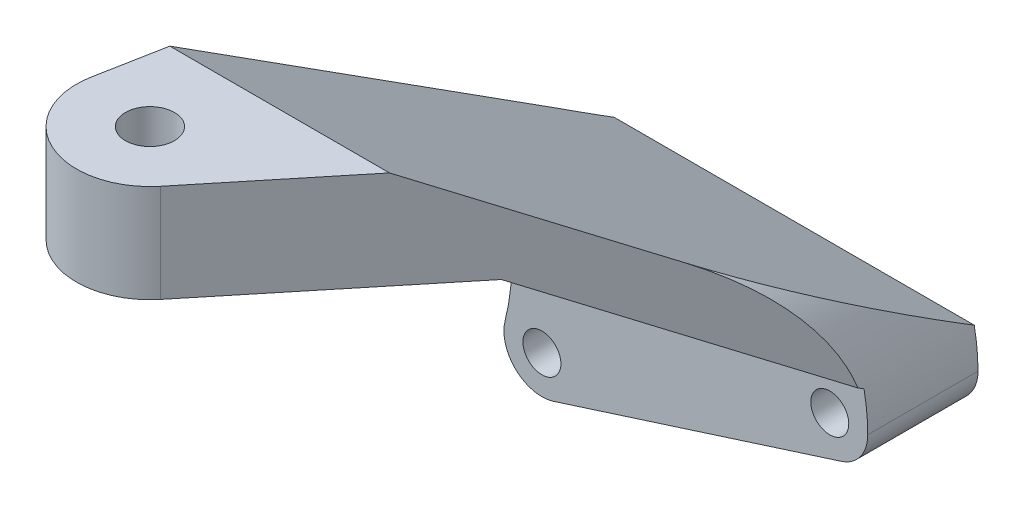
ISO-10303-21;
HEADER;
FILE_DESCRIPTION(('STEP AP214'),'2;1');
FILE_NAME('part.step','',(''),(''),'','','');
FILE_SCHEMA(('AUTOMOTIVE_DESIGN { 1 0 10303 214 1 1 1 1 }'));
ENDSEC;
DATA;
#1=APPLICATION_CONTEXT('core data for automotive mechanical design processes');
#2=APPLICATION_PROTOCOL_DEFINITION('international standard','automotive_design',2000,#1);
#3=PRODUCT_CONTEXT('',#1,'mechanical');
#4=PRODUCT('Part','Part','',(#3));
#5=PRODUCT_RELATED_PRODUCT_CATEGORY('part','',(#4));
#6=PRODUCT_DEFINITION_FORMATION('','',#4);
#7=PRODUCT_DEFINITION_CONTEXT('part definition',#1,'design');
#8=PRODUCT_DEFINITION('design','',#6,#7);
#9=PRODUCT_DEFINITION_SHAPE('','',#8);
#10=(LENGTH_UNIT() NAMED_UNIT(*) SI_UNIT(.MILLI.,.METRE.));
#11=(NAMED_UNIT(*) PLANE_ANGLE_UNIT() SI_UNIT($,.RADIAN.));
#12=(NAMED_UNIT(*) SI_UNIT($,.STERADIAN.) SOLID_ANGLE_UNIT());
#13=UNCERTAINTY_MEASURE_WITH_UNIT(LENGTH_MEASURE(1.E-05),#10,'distance_accuracy_value','');
#14=(GEOMETRIC_REPRESENTATION_CONTEXT(3) GLOBAL_UNCERTAINTY_ASSIGNED_CONTEXT((#13)) GLOBAL_UNIT_ASSIGNED_CONTEXT((#10,
#11,#12)) REPRESENTATION_CONTEXT('',''));
#15=CARTESIAN_POINT('',(0.,0.,0.));
#16=DIRECTION('',(0.,0.,1.));
#17=DIRECTION('',(1.,0.,0.));
#18=AXIS2_PLACEMENT_3D('',#15,#16,#17);
#19=CARTESIAN_POINT('',(23.5,7.50725648955731,-9.));
#20=DIRECTION('',(0.,0.,1.));
#21=DIRECTION('',(1.,0.,0.));
#22=AXIS2_PLACEMENT_3D('',#19,#20,#21);
#23=CYLINDRICAL_SURFACE('',#22,3.1);
#24=CARTESIAN_POINT('',(23.5,7.50725648955731,0.));
#25=DIRECTION('',(0.,0.,1.));
#26=DIRECTION('',(1.,0.,0.));
#27=AXIS2_PLACEMENT_3D('',#24,#25,#26);
#28=CIRCLE('',#27,3.1);
#29=CARTESIAN_POINT('',(26.6,7.50725648955729,0.));
#30=VERTEX_POINT('',#29);
#31=CARTESIAN_POINT('',(24.4433520517887,4.55427716243936,0.));
#32=VERTEX_POINT('',#31);
#33=EDGE_CURVE('E173',#30,#32,#28,.F.);
#34=ORIENTED_EDGE('',*,*,#33,.F.);
#35=DIRECTION('',(0.,0.,1.));
#36=VECTOR('',#35,1.);
#37=CARTESIAN_POINT('',(26.6,7.50725648955729,-9.));
#38=LINE('',#37,#36);
#39=CARTESIAN_POINT('',(26.6,7.50725648955729,9.));
#40=VERTEX_POINT('',#39);
#41=EDGE_CURVE('E52',#30,#40,#38,.T.);
#42=ORIENTED_EDGE('',*,*,#41,.T.);
#43=CARTESIAN_POINT('',(23.5,7.50725648955731,9.));
#44=DIRECTION('',(0.,0.,1.));
#45=DIRECTION('',(1.,0.,0.));
#46=AXIS2_PLACEMENT_3D('',#43,#44,#45);
#47=CIRCLE('',#46,3.1);
#48=CARTESIAN_POINT('',(24.4433520517887,4.55427716243936,9.));
#49=VERTEX_POINT('',#48);
#50=EDGE_CURVE('E171',#49,#40,#47,.T.);
#51=ORIENTED_EDGE('',*,*,#50,.F.);
#52=DIRECTION('',(0.,0.,1.));
#53=VECTOR('',#52,1.);
#54=CARTESIAN_POINT('',(24.4433520517887,4.55427716243936,-9.));
#55=LINE('',#54,#53);
#56=EDGE_CURVE('E14',#32,#49,#55,.T.);
#57=ORIENTED_EDGE('',*,*,#56,.F.);
#58=EDGE_LOOP('',(#34,#42,#51,#57));
#59=FACE_BOUND('',#58,.T.);
#60=ADVANCED_FACE('F49',(#59),#23,.T.);
#61=CARTESIAN_POINT('',(24.4433520517887,4.55427716243936,-9.));
#62=DIRECTION('',(0.304307113480232,-0.952573976489663,0.));
#63=DIRECTION('',(0.952573976489663,0.304307113480232,0.));
#64=AXIS2_PLACEMENT_3D('',#61,#62,#63);
#65=PLANE('',#64);
#66=DIRECTION('',(-0.952573976489663,-0.304307113480232,0.));
#67=VECTOR('',#66,1.);
#68=CARTESIAN_POINT('',(24.4433520517887,4.55427716243936,0.));
#69=LINE('',#68,#67);
#70=CARTESIAN_POINT('',(0.943352051788718,-2.95297932711796,0.));
#71=VERTEX_POINT('',#70);
#72=EDGE_CURVE('E285',#32,#71,#69,.T.);
#73=ORIENTED_EDGE('',*,*,#72,.F.);
#74=ORIENTED_EDGE('',*,*,#56,.T.);
#75=DIRECTION('',(0.952573976489663,0.304307113480232,0.));
#76=VECTOR('',#75,1.);
#77=CARTESIAN_POINT('',(24.4433520517887,4.55427716243936,9.));
#78=LINE('',#77,#76);
#79=CARTESIAN_POINT('',(0.943352051788718,-2.95297932711796,9.));
#80=VERTEX_POINT('',#79);
#81=EDGE_CURVE('E184',#80,#49,#78,.T.);
#82=ORIENTED_EDGE('',*,*,#81,.F.);
#83=DIRECTION('',(0.,0.,1.));
#84=VECTOR('',#83,1.);
#85=CARTESIAN_POINT('',(0.943352051788718,-2.95297932711796,-9.));
#86=LINE('',#85,#84);
#87=EDGE_CURVE('E57',#71,#80,#86,.T.);
#88=ORIENTED_EDGE('',*,*,#87,.F.);
#89=EDGE_LOOP('',(#73,#74,#82,#88));
#90=FACE_BOUND('',#89,.T.);
#91=ADVANCED_FACE('F274',(#90),#65,.T.);
#92=CARTESIAN_POINT('',(0.,0.,-9.));
#93=DIRECTION('',(0.,0.,1.));
#94=DIRECTION('',(1.,0.,0.));
#95=AXIS2_PLACEMENT_3D('',#92,#93,#94);
#96=CYLINDRICAL_SURFACE('',#95,3.1);
#97=CARTESIAN_POINT('',(0.,0.,0.));
#98=DIRECTION('',(0.,0.,1.));
#99=DIRECTION('',(1.,0.,0.));
#100=AXIS2_PLACEMENT_3D('',#97,#98,#99);
#101=CIRCLE('',#100,3.1);
#102=CARTESIAN_POINT('',(-3.00882555223066,0.746303421031855,0.));
#103=VERTEX_POINT('',#102);
#104=EDGE_CURVE('E286',#71,#103,#101,.F.);
#105=ORIENTED_EDGE('',*,*,#104,.F.);
#106=ORIENTED_EDGE('',*,*,#87,.T.);
#107=CARTESIAN_POINT('',(0.,0.,9.));
#108=DIRECTION('',(0.,0.,1.));
#109=DIRECTION('',(1.,0.,0.));
#110=AXIS2_PLACEMENT_3D('',#107,#108,#109);
#111=CIRCLE('',#110,3.1);
#112=CARTESIAN_POINT('',(-3.00882555223066,0.746303421031855,9.));
#113=VERTEX_POINT('',#112);
#114=EDGE_CURVE('E188',#113,#80,#111,.T.);
#115=ORIENTED_EDGE('',*,*,#114,.F.);
#116=DIRECTION('',(0.,0.,1.));
#117=VECTOR('',#116,1.);
#118=CARTESIAN_POINT('',(-3.00882555223066,0.746303421031855,-43.));
#119=LINE('',#118,#117);
#120=EDGE_CURVE('E155',#103,#113,#119,.T.);
#121=ORIENTED_EDGE('',*,*,#120,.F.);
#122=EDGE_LOOP('',(#105,#106,#115,#121));
#123=FACE_BOUND('',#122,.T.);
#124=ADVANCED_FACE('F264',(#123),#96,.T.);
#125=CARTESIAN_POINT('',(0.,0.,-9.));
#126=DIRECTION('',(0.,0.,1.));
#127=DIRECTION('',(1.,0.,0.));
#128=AXIS2_PLACEMENT_3D('',#125,#126,#127);
#129=CYLINDRICAL_SURFACE('',#128,1.55);
#130=CARTESIAN_POINT('',(0.,0.,0.));
#131=DIRECTION('',(0.,0.,1.));
#132=DIRECTION('',(1.,0.,0.));
#133=AXIS2_PLACEMENT_3D('',#130,#131,#132);
#134=CIRCLE('',#133,1.55);
#135=CARTESIAN_POINT('',(1.55,0.,0.));
#136=VERTEX_POINT('',#135);
#137=EDGE_CURVE('E295',#136,#136,#134,.F.);
#138=ORIENTED_EDGE('',*,*,#137,.T.);
#139=EDGE_LOOP('',(#138));
#140=FACE_BOUND('',#139,.T.);
#141=CARTESIAN_POINT('',(0.,0.,9.));
#142=DIRECTION('',(0.,0.,1.));
#143=DIRECTION('',(1.,0.,0.));
#144=AXIS2_PLACEMENT_3D('',#141,#142,#143);
#145=CIRCLE('',#144,1.55);
#146=CARTESIAN_POINT('',(1.55,0.,9.));
#147=VERTEX_POINT('',#146);
#148=EDGE_CURVE('E186',#147,#147,#145,.T.);
#149=ORIENTED_EDGE('',*,*,#148,.T.);
#150=EDGE_LOOP('',(#149));
#151=FACE_BOUND('',#150,.T.);
#152=ADVANCED_FACE('F262',(#140,#151),#129,.F.);
#153=CARTESIAN_POINT('',(23.5,7.50725648955731,-9.));
#154=DIRECTION('',(0.,0.,1.));
#155=DIRECTION('',(1.,0.,0.));
#156=AXIS2_PLACEMENT_3D('',#153,#154,#155);
#157=CYLINDRICAL_SURFACE('',#156,1.55);
#158=CARTESIAN_POINT('',(23.5,7.50725648955731,0.));
#159=DIRECTION('',(0.,0.,1.));
#160=DIRECTION('',(1.,0.,0.));
#161=AXIS2_PLACEMENT_3D('',#158,#159,#160);
#162=CIRCLE('',#161,1.55);
#163=CARTESIAN_POINT('',(25.05,7.50725648955731,0.));
#164=VERTEX_POINT('',#163);
#165=EDGE_CURVE('E288',#164,#164,#162,.F.);
#166=ORIENTED_EDGE('',*,*,#165,.T.);
#167=EDGE_LOOP('',(#166));
#168=FACE_BOUND('',#167,.T.);
#169=CARTESIAN_POINT('',(23.5,7.50725648955731,9.));
#170=DIRECTION('',(0.,0.,1.));
#171=DIRECTION('',(1.,0.,0.));
#172=AXIS2_PLACEMENT_3D('',#169,#170,#171);
#173=CIRCLE('',#172,1.55);
#174=CARTESIAN_POINT('',(25.05,7.50725648955731,9.));
#175=VERTEX_POINT('',#174);
#176=EDGE_CURVE('E191',#175,#175,#173,.T.);
#177=ORIENTED_EDGE('',*,*,#176,.T.);
#178=EDGE_LOOP('',(#177));
#179=FACE_BOUND('',#178,.T.);
#180=ADVANCED_FACE('F254',(#168,#179),#157,.F.);
#181=CARTESIAN_POINT('',(-22.1740113617438,5.5,-43.));
#182=DIRECTION('',(0.,0.,1.));
#183=DIRECTION('',(1.,0.,0.));
#184=AXIS2_PLACEMENT_3D('',#181,#182,#183);
#185=CYLINDRICAL_SURFACE('',#184,19.7459357407558);
#186=CARTESIAN_POINT('',(-22.1740113617438,5.5,-8.95610993389123));
#187=DIRECTION('',(0.,0.868682370719737,-0.495369497244973));
#188=DIRECTION('',(0.,-0.495369497244973,-0.868682370719737));
#189=AXIS2_PLACEMENT_3D('',#186,#187,#188);
#190=ELLIPSE('',#189,39.8610246504357,19.7459357407558);
#191=CARTESIAN_POINT('',(-3.83385471616214,12.8171464720603,3.87527387073072));
#192=VERTEX_POINT('',#191);
#193=CARTESIAN_POINT('',(-3.09999999999999,10.6072564895573,0.));
#194=VERTEX_POINT('',#193);
#195=EDGE_CURVE('E156',#192,#194,#190,.T.);
#196=ORIENTED_EDGE('',*,*,#195,.T.);
#197=CARTESIAN_POINT('',(-22.1740113617438,5.5,0.));
#198=DIRECTION('',(0.,0.,1.));
#199=DIRECTION('',(1.,0.,0.));
#200=AXIS2_PLACEMENT_3D('',#197,#198,#199);
#201=CIRCLE('',#200,19.7459357407558);
#202=EDGE_CURVE('E65',#194,#103,#201,.F.);
#203=ORIENTED_EDGE('',*,*,#202,.T.);
#204=ORIENTED_EDGE('',*,*,#120,.T.);
#205=CARTESIAN_POINT('',(-22.1740113617438,5.5,9.));
#206=DIRECTION('',(0.,0.,1.));
#207=DIRECTION('',(1.,0.,0.));
#208=AXIS2_PLACEMENT_3D('',#205,#206,#207);
#209=CIRCLE('',#208,19.7459357407558);
#210=CARTESIAN_POINT('',(-3.09999999999999,10.6072564895573,9.));
#211=VERTEX_POINT('',#210);
#212=EDGE_CURVE('E218',#113,#211,#209,.T.);
#213=ORIENTED_EDGE('',*,*,#212,.T.);
#214=CARTESIAN_POINT('',(-22.1740113617438,5.5,0.0438900661087621));
#215=DIRECTION('',(0.,-0.868682370719737,0.495369497244973));
#216=DIRECTION('',(0.,-0.495369497244973,-0.868682370719737));
#217=AXIS2_PLACEMENT_3D('',#214,#215,#216);
#218=ELLIPSE('',#217,39.8610246504357,19.7459357407558);
#219=CARTESIAN_POINT('',(-7.49358291155266,18.7055669623411,23.2012368130196));
#220=VERTEX_POINT('',#219);
#221=EDGE_CURVE('E207',#211,#220,#218,.T.);
#222=ORIENTED_EDGE('',*,*,#221,.T.);
#223=CARTESIAN_POINT('',(-22.1740113617438,5.5,100.724320784845));
#224=DIRECTION('',(-0.98253805535331,0.,-0.186061736481567));
#225=DIRECTION('',(0.186061736481567,0.,-0.98253805535331));
#226=AXIS2_PLACEMENT_3D('',#223,#224,#225);
#227=ELLIPSE('',#226,106.125719958074,19.7459357407558);
#228=EDGE_CURVE('E180',#220,#192,#227,.T.);
#229=ORIENTED_EDGE('',*,*,#228,.T.);
#230=EDGE_LOOP('',(#196,#203,#204,#213,#222,#229));
#231=FACE_BOUND('',#230,.T.);
#232=ADVANCED_FACE('F271',(#231),#185,.F.);
#233=CARTESIAN_POINT('',(10.8063921151052,7.50725648955729,-43.));
#234=DIRECTION('',(0.,0.,1.));
#235=DIRECTION('',(1.,0.,0.));
#236=AXIS2_PLACEMENT_3D('',#233,#234,#235);
#237=CYLINDRICAL_SURFACE('',#236,15.7936078848948);
#238=ORIENTED_EDGE('',*,*,#41,.F.);
#239=CARTESIAN_POINT('',(10.8063921151052,7.50725648955729,0.));
#240=DIRECTION('',(0.,0.,1.));
#241=DIRECTION('',(1.,0.,0.));
#242=AXIS2_PLACEMENT_3D('',#239,#240,#241);
#243=CIRCLE('',#242,15.7936078848948);
#244=CARTESIAN_POINT('',(26.2927748438709,10.6072564895573,0.));
#245=VERTEX_POINT('',#244);
#246=EDGE_CURVE('E141',#30,#245,#243,.T.);
#247=ORIENTED_EDGE('',*,*,#246,.T.);
#248=CARTESIAN_POINT('',(10.8063921151052,7.50725648955729,-5.43617514644728));
#249=DIRECTION('',(0.,0.868682370719737,-0.495369497244973));
#250=DIRECTION('',(0.,-0.495369497244973,-0.868682370719737));
#251=AXIS2_PLACEMENT_3D('',#248,#249,#250);
#252=ELLIPSE('',#251,31.8824795889369,15.7936078848948);
#253=CARTESIAN_POINT('',(19.8515003160245,20.4542278595524,17.2676971062402));
#254=VERTEX_POINT('',#253);
#255=EDGE_CURVE('E73',#245,#254,#252,.F.);
#256=ORIENTED_EDGE('',*,*,#255,.T.);
#257=CARTESIAN_POINT('',(10.8063921151052,7.50725648955729,28.3490067899235));
#258=DIRECTION('',(-0.774690613783252,0.,-0.632340456491697));
#259=DIRECTION('',(0.632340456491697,0.,-0.774690613783252));
#260=AXIS2_PLACEMENT_3D('',#257,#258,#259);
#261=ELLIPSE('',#260,24.9764311657673,15.7936078848948);
#262=CARTESIAN_POINT('',(26.2403515875024,10.8585167041947,9.44061114003321));
#263=VERTEX_POINT('',#262);
#264=EDGE_CURVE('E297',#263,#254,#261,.F.);
#265=ORIENTED_EDGE('',*,*,#264,.F.);
#266=CARTESIAN_POINT('',(10.8063921151052,7.50725648955729,3.56382485355272));
#267=DIRECTION('',(0.,-0.868682370719737,0.495369497244973));
#268=DIRECTION('',(0.,-0.495369497244973,-0.868682370719737));
#269=AXIS2_PLACEMENT_3D('',#266,#267,#268);
#270=ELLIPSE('',#269,31.8824795889369,15.7936078848948);
#271=CARTESIAN_POINT('',(26.2927748438708,10.6072564895573,9.));
#272=VERTEX_POINT('',#271);
#273=EDGE_CURVE('E176',#263,#272,#270,.F.);
#274=ORIENTED_EDGE('',*,*,#273,.T.);
#275=CARTESIAN_POINT('',(10.8063921151052,7.50725648955729,9.));
#276=DIRECTION('',(0.,0.,1.));
#277=DIRECTION('',(1.,0.,0.));
#278=AXIS2_PLACEMENT_3D('',#275,#276,#277);
#279=CIRCLE('',#278,15.7936078848948);
#280=EDGE_CURVE('E175',#272,#40,#279,.F.);
#281=ORIENTED_EDGE('',*,*,#280,.T.);
#282=EDGE_LOOP('',(#238,#247,#256,#265,#274,#281));
#283=FACE_BOUND('',#282,.T.);
#284=ADVANCED_FACE('F148',(#283),#237,.T.);
#285=CARTESIAN_POINT('',(23.5,7.50725648955731,9.));
#286=DIRECTION('',(0.,0.,-1.));
#287=DIRECTION('',(1.,0.,0.));
#288=AXIS2_PLACEMENT_3D('',#285,#286,#287);
#289=PLANE('',#288);
#290=ORIENTED_EDGE('',*,*,#176,.F.);
#291=EDGE_LOOP('',(#290));
#292=FACE_BOUND('',#291,.T.);
#293=ORIENTED_EDGE('',*,*,#148,.F.);
#294=EDGE_LOOP('',(#293));
#295=FACE_BOUND('',#294,.T.);
#296=DIRECTION('',(-1.,0.,0.));
#297=VECTOR('',#296,1.);
#298=CARTESIAN_POINT('',(-3.1,10.6072564895573,9.));
#299=LINE('',#298,#297);
#300=EDGE_CURVE('E185',#272,#211,#299,.T.);
#301=ORIENTED_EDGE('',*,*,#300,.T.);
#302=ORIENTED_EDGE('',*,*,#212,.F.);
#303=ORIENTED_EDGE('',*,*,#114,.T.);
#304=ORIENTED_EDGE('',*,*,#81,.T.);
#305=ORIENTED_EDGE('',*,*,#50,.T.);
#306=ORIENTED_EDGE('',*,*,#280,.F.);
#307=EDGE_LOOP('',(#301,#302,#303,#304,#305,#306));
#308=FACE_BOUND('',#307,.T.);
#309=ADVANCED_FACE('F182',(#292,#295,#308),#289,.F.);
#310=CARTESIAN_POINT('',(-4.,28.,37.));
#311=DIRECTION('',(0.,1.,0.));
#312=DIRECTION('',(0.,0.,-1.));
#313=AXIS2_PLACEMENT_3D('',#310,#311,#312);
#314=PLANE('',#313);
#315=DIRECTION('',(1.,0.,0.));
#316=VECTOR('',#315,1.);
#317=CARTESIAN_POINT('',(-50.,28.,30.5));
#318=LINE('',#317,#316);
#319=CARTESIAN_POINT('',(-8.87573859024439,28.,30.5));
#320=VERTEX_POINT('',#319);
#321=CARTESIAN_POINT('',(9.05064600927865,28.,30.5));
#322=VERTEX_POINT('',#321);
#323=EDGE_CURVE('E144',#320,#322,#318,.T.);
#324=ORIENTED_EDGE('',*,*,#323,.F.);
#325=DIRECTION('',(-0.186061736481567,0.,0.98253805535331));
#326=VECTOR('',#325,1.);
#327=CARTESIAN_POINT('',(-3.1,28.,0.));
#328=LINE('',#327,#326);
#329=CARTESIAN_POINT('',(-9.89522833211987,28.,35.8836295811106));
#330=VERTEX_POINT('',#329);
#331=EDGE_CURVE('E245',#320,#330,#328,.T.);
#332=ORIENTED_EDGE('',*,*,#331,.T.);
#333=CARTESIAN_POINT('',(-4.,28.,37.));
#334=DIRECTION('',(0.,-1.,0.));
#335=DIRECTION('',(0.,0.,-1.));
#336=AXIS2_PLACEMENT_3D('',#333,#334,#335);
#337=CIRCLE('',#336,6.);
#338=CARTESIAN_POINT('',(0.648143682699515,28.,40.7940427389502));
#339=VERTEX_POINT('',#338);
#340=EDGE_CURVE('E242',#339,#330,#337,.T.);
#341=ORIENTED_EDGE('',*,*,#340,.F.);
#342=DIRECTION('',(-0.632340456491697,0.,0.774690613783252));
#343=VECTOR('',#342,1.);
#344=CARTESIAN_POINT('',(26.6,28.,9.));
#345=LINE('',#344,#343);
#346=EDGE_CURVE('E239',#322,#339,#345,.T.);
#347=ORIENTED_EDGE('',*,*,#346,.F.);
#348=EDGE_LOOP('',(#324,#332,#341,#347));
#349=FACE_BOUND('',#348,.T.);
#350=CARTESIAN_POINT('',(-4.,28.,37.));
#351=DIRECTION('',(0.,-1.,0.));
#352=DIRECTION('',(0.,0.,-1.));
#353=AXIS2_PLACEMENT_3D('',#350,#351,#352);
#354=CIRCLE('',#353,2.);
#355=CARTESIAN_POINT('',(-4.,28.,35.));
#356=VERTEX_POINT('',#355);
#357=EDGE_CURVE('E236',#356,#356,#354,.T.);
#358=ORIENTED_EDGE('',*,*,#357,.T.);
#359=EDGE_LOOP('',(#358));
#360=FACE_BOUND('',#359,.T.);
#361=ADVANCED_FACE('F258',(#349,#360),#314,.T.);
#362=CARTESIAN_POINT('',(26.6,-45.8600792010878,9.));
#363=DIRECTION('',(0.774690613783252,0.,0.632340456491697));
#364=DIRECTION('',(-0.632340456491697,0.,0.774690613783252));
#365=AXIS2_PLACEMENT_3D('',#362,#363,#364);
#366=PLANE('',#365);
#367=ORIENTED_EDGE('',*,*,#264,.T.);
#368=DIRECTION('',(-0.578412616114516,0.404094868832214,0.708622736371786));
#369=VECTOR('',#368,1.);
#370=CARTESIAN_POINT('',(40.9978992624922,5.68077536131933,-8.63910137702213));
#371=LINE('',#370,#369);
#372=EDGE_CURVE('E153',#254,#322,#371,.T.);
#373=ORIENTED_EDGE('',*,*,#372,.T.);
#374=ORIENTED_EDGE('',*,*,#346,.T.);
#375=DIRECTION('',(0.,1.,0.));
#376=VECTOR('',#375,1.);
#377=CARTESIAN_POINT('',(0.648143682699515,-45.8600792010878,40.7940427389502));
#378=LINE('',#377,#376);
#379=CARTESIAN_POINT('',(0.648143682699515,20.,40.7940427389502));
#380=VERTEX_POINT('',#379);
#381=EDGE_CURVE('E248',#380,#339,#378,.T.);
#382=ORIENTED_EDGE('',*,*,#381,.F.);
#383=DIRECTION('',(0.632340456491697,0.,-0.774690613783252));
#384=VECTOR('',#383,1.);
#385=CARTESIAN_POINT('',(26.6,20.,9.));
#386=LINE('',#385,#384);
#387=CARTESIAN_POINT('',(13.1554310004773,20.,25.4711609123942));
#388=VERTEX_POINT('',#387);
#389=EDGE_CURVE('E229',#380,#388,#386,.T.);
#390=ORIENTED_EDGE('',*,*,#389,.T.);
#391=DIRECTION('',(0.578412616114516,-0.404094868832214,-0.708622736371786));
#392=VECTOR('',#391,1.);
#393=CARTESIAN_POINT('',(39.7983119728977,1.38655487118386,-7.16946740987341));
#394=LINE('',#393,#392);
#395=EDGE_CURVE('E233',#388,#263,#394,.T.);
#396=ORIENTED_EDGE('',*,*,#395,.T.);
#397=EDGE_LOOP('',(#367,#373,#374,#382,#390,#396));
#398=FACE_BOUND('',#397,.T.);
#399=ADVANCED_FACE('F299',(#398),#366,.T.);
#400=CARTESIAN_POINT('',(-4.,-45.8600792010878,37.));
#401=DIRECTION('',(0.,1.,0.));
#402=DIRECTION('',(0.,0.,-1.));
#403=AXIS2_PLACEMENT_3D('',#400,#401,#402);
#404=CYLINDRICAL_SURFACE('',#403,6.);
#405=CARTESIAN_POINT('',(-4.,20.,37.));
#406=DIRECTION('',(0.,-1.,0.));
#407=DIRECTION('',(0.,0.,-1.));
#408=AXIS2_PLACEMENT_3D('',#405,#406,#407);
#409=CIRCLE('',#408,6.);
#410=CARTESIAN_POINT('',(-9.89522833211987,20.,35.8836295811106));
#411=VERTEX_POINT('',#410);
#412=EDGE_CURVE('E227',#411,#380,#409,.F.);
#413=ORIENTED_EDGE('',*,*,#412,.T.);
#414=ORIENTED_EDGE('',*,*,#381,.T.);
#415=ORIENTED_EDGE('',*,*,#340,.T.);
#416=DIRECTION('',(0.,1.,0.));
#417=VECTOR('',#416,1.);
#418=CARTESIAN_POINT('',(-9.89522833211987,-45.8600792010878,35.8836295811106));
#419=LINE('',#418,#417);
#420=EDGE_CURVE('E249',#411,#330,#419,.T.);
#421=ORIENTED_EDGE('',*,*,#420,.F.);
#422=EDGE_LOOP('',(#413,#414,#415,#421));
#423=FACE_BOUND('',#422,.T.);
#424=ADVANCED_FACE('F310',(#423),#404,.T.);
#425=CARTESIAN_POINT('',(-3.1,-45.8600792010878,0.));
#426=DIRECTION('',(0.98253805535331,0.,0.186061736481567));
#427=DIRECTION('',(-0.186061736481567,0.,0.98253805535331));
#428=AXIS2_PLACEMENT_3D('',#425,#426,#427);
#429=PLANE('',#428);
#430=DIRECTION('',(0.16231948764011,-0.488800033304736,-0.857162126656061));
#431=VECTOR('',#430,1.);
#432=CARTESIAN_POINT('',(0.973013836704717,-6.79027973292241,-21.5084045232451));
#433=LINE('',#432,#431);
#434=CARTESIAN_POINT('',(-7.92343498426361,20.,25.4711609123942));
#435=VERTEX_POINT('',#434);
#436=EDGE_CURVE('E159',#435,#220,#433,.T.);
#437=ORIENTED_EDGE('',*,*,#436,.F.);
#438=DIRECTION('',(0.186061736481567,0.,-0.98253805535331));
#439=VECTOR('',#438,1.);
#440=CARTESIAN_POINT('',(-3.1,20.,0.));
#441=LINE('',#440,#439);
#442=EDGE_CURVE('E201',#411,#435,#441,.T.);
#443=ORIENTED_EDGE('',*,*,#442,.F.);
#444=ORIENTED_EDGE('',*,*,#420,.T.);
#445=ORIENTED_EDGE('',*,*,#331,.F.);
#446=DIRECTION('',(-0.16231948764011,0.488800033304736,0.857162126656061));
#447=VECTOR('',#446,1.);
#448=CARTESIAN_POINT('',(1.38021841534234,-2.88422837446145,-23.6587337762735));
#449=LINE('',#448,#447);
#450=EDGE_CURVE('E197',#192,#320,#449,.T.);
#451=ORIENTED_EDGE('',*,*,#450,.F.);
#452=ORIENTED_EDGE('',*,*,#228,.F.);
#453=EDGE_LOOP('',(#437,#443,#444,#445,#451,#452));
#454=FACE_BOUND('',#453,.T.);
#455=ADVANCED_FACE('F212',(#454),#429,.F.);
#456=CARTESIAN_POINT('',(-4.,-46.4247525579942,37.));
#457=DIRECTION('',(0.,1.,0.));
#458=DIRECTION('',(0.,0.,-1.));
#459=AXIS2_PLACEMENT_3D('',#456,#457,#458);
#460=CYLINDRICAL_SURFACE('',#459,2.);
#461=CARTESIAN_POINT('',(-4.,20.,37.));
#462=DIRECTION('',(0.,-1.,0.));
#463=DIRECTION('',(0.,0.,-1.));
#464=AXIS2_PLACEMENT_3D('',#461,#462,#463);
#465=CIRCLE('',#464,2.);
#466=CARTESIAN_POINT('',(-4.,20.,35.));
#467=VERTEX_POINT('',#466);
#468=EDGE_CURVE('E198',#467,#467,#465,.F.);
#469=ORIENTED_EDGE('',*,*,#468,.F.);
#470=EDGE_LOOP('',(#469));
#471=FACE_BOUND('',#470,.T.);
#472=ORIENTED_EDGE('',*,*,#357,.F.);
#473=EDGE_LOOP('',(#472));
#474=FACE_BOUND('',#473,.T.);
#475=ADVANCED_FACE('F319',(#471,#474),#460,.F.);
#476=CARTESIAN_POINT('',(-50.,10.6072564895573,9.));
#477=DIRECTION('',(0.,0.868682370719737,-0.495369497244973));
#478=DIRECTION('',(0.,-0.495369497244973,-0.868682370719737));
#479=AXIS2_PLACEMENT_3D('',#476,#477,#478);
#480=PLANE('',#479);
#481=ORIENTED_EDGE('',*,*,#395,.F.);
#482=DIRECTION('',(1.,0.,0.));
#483=VECTOR('',#482,1.);
#484=CARTESIAN_POINT('',(-50.,20.,25.4711609123942));
#485=LINE('',#484,#483);
#486=EDGE_CURVE('E145',#435,#388,#485,.T.);
#487=ORIENTED_EDGE('',*,*,#486,.F.);
#488=ORIENTED_EDGE('',*,*,#436,.T.);
#489=ORIENTED_EDGE('',*,*,#221,.F.);
#490=ORIENTED_EDGE('',*,*,#300,.F.);
#491=ORIENTED_EDGE('',*,*,#273,.F.);
#492=EDGE_LOOP('',(#481,#487,#488,#489,#490,#491));
#493=FACE_BOUND('',#492,.T.);
#494=ADVANCED_FACE('F206',(#493),#480,.F.);
#495=CARTESIAN_POINT('',(-50.,20.,43.));
#496=DIRECTION('',(0.,1.,0.));
#497=DIRECTION('',(0.,0.,-1.));
#498=AXIS2_PLACEMENT_3D('',#495,#496,#497);
#499=PLANE('',#498);
#500=ORIENTED_EDGE('',*,*,#389,.F.);
#501=ORIENTED_EDGE('',*,*,#412,.F.);
#502=ORIENTED_EDGE('',*,*,#442,.T.);
#503=ORIENTED_EDGE('',*,*,#486,.T.);
#504=EDGE_LOOP('',(#500,#501,#502,#503));
#505=FACE_BOUND('',#504,.T.);
#506=ORIENTED_EDGE('',*,*,#468,.T.);
#507=EDGE_LOOP('',(#506));
#508=FACE_BOUND('',#507,.T.);
#509=ADVANCED_FACE('F313',(#505,#508),#499,.F.);
#510=CARTESIAN_POINT('',(-50.,10.6072564895573,0.));
#511=DIRECTION('',(0.,-0.868682370719737,0.495369497244973));
#512=DIRECTION('',(0.,0.495369497244973,0.868682370719737));
#513=AXIS2_PLACEMENT_3D('',#510,#511,#512);
#514=PLANE('',#513);
#515=DIRECTION('',(1.,0.,0.));
#516=VECTOR('',#515,1.);
#517=CARTESIAN_POINT('',(-50.,10.6072564895573,0.));
#518=LINE('',#517,#516);
#519=EDGE_CURVE('E138',#194,#245,#518,.T.);
#520=ORIENTED_EDGE('',*,*,#519,.F.);
#521=ORIENTED_EDGE('',*,*,#195,.F.);
#522=ORIENTED_EDGE('',*,*,#450,.T.);
#523=ORIENTED_EDGE('',*,*,#323,.T.);
#524=ORIENTED_EDGE('',*,*,#372,.F.);
#525=ORIENTED_EDGE('',*,*,#255,.F.);
#526=EDGE_LOOP('',(#520,#521,#522,#523,#524,#525));
#527=FACE_BOUND('',#526,.T.);
#528=ADVANCED_FACE('F151',(#527),#514,.F.);
#529=CARTESIAN_POINT('',(0.,0.,0.));
#530=DIRECTION('',(0.,0.,1.));
#531=DIRECTION('',(1.,0.,0.));
#532=AXIS2_PLACEMENT_3D('',#529,#530,#531);
#533=PLANE('',#532);
#534=ORIENTED_EDGE('',*,*,#165,.F.);
#535=EDGE_LOOP('',(#534));
#536=FACE_BOUND('',#535,.T.);
#537=ORIENTED_EDGE('',*,*,#33,.T.);
#538=ORIENTED_EDGE('',*,*,#72,.T.);
#539=ORIENTED_EDGE('',*,*,#104,.T.);
#540=ORIENTED_EDGE('',*,*,#202,.F.);
#541=ORIENTED_EDGE('',*,*,#519,.T.);
#542=ORIENTED_EDGE('',*,*,#246,.F.);
#543=EDGE_LOOP('',(#537,#538,#539,#540,#541,#542));
#544=FACE_BOUND('',#543,.T.);
#545=ORIENTED_EDGE('',*,*,#137,.F.);
#546=EDGE_LOOP('',(#545));
#547=FACE_BOUND('',#546,.T.);
#548=ADVANCED_FACE('F139',(#536,#544,#547),#533,.F.);
#549=CLOSED_SHELL('',(#60,#91,#124,#152,#180,#232,#284,#309,#361,#399,#424,#455,#475,#494,#509,
#528,#548));
#550=MANIFOLD_SOLID_BREP('B2',#549);
#551=ADVANCED_BREP_SHAPE_REPRESENTATION('',(#18,#550),#14);
#552=SHAPE_DEFINITION_REPRESENTATION(#9,#551);
ENDSEC;
END-ISO-10303-21;
